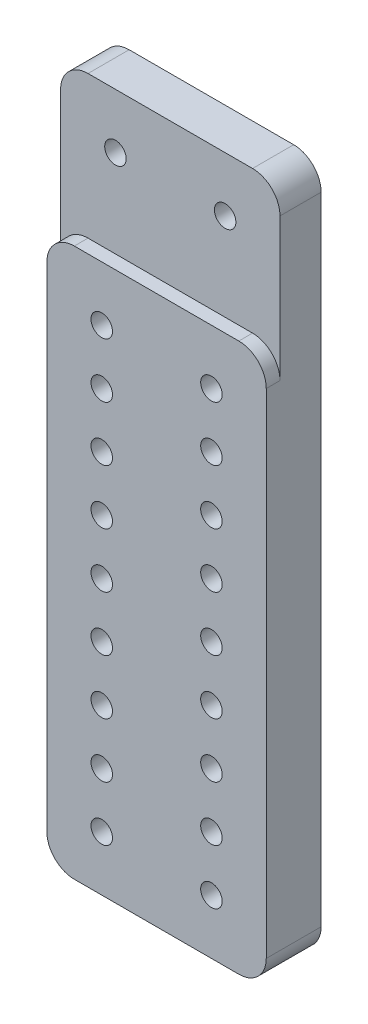
ISO-10303-21;
HEADER;
FILE_DESCRIPTION(('STEP AP214'),'2;1');
FILE_NAME('part.step','',(''),(''),'','','');
FILE_SCHEMA(('AUTOMOTIVE_DESIGN { 1 0 10303 214 1 1 1 1 }'));
ENDSEC;
DATA;
#1=APPLICATION_CONTEXT('core data for automotive mechanical design processes');
#2=APPLICATION_PROTOCOL_DEFINITION('international standard','automotive_design',2000,#1);
#3=PRODUCT_CONTEXT('',#1,'mechanical');
#4=PRODUCT('Part','Part','',(#3));
#5=PRODUCT_RELATED_PRODUCT_CATEGORY('part','',(#4));
#6=PRODUCT_DEFINITION_FORMATION('','',#4);
#7=PRODUCT_DEFINITION_CONTEXT('part definition',#1,'design');
#8=PRODUCT_DEFINITION('design','',#6,#7);
#9=PRODUCT_DEFINITION_SHAPE('','',#8);
#10=(LENGTH_UNIT() NAMED_UNIT(*) SI_UNIT(.MILLI.,.METRE.));
#11=(NAMED_UNIT(*) PLANE_ANGLE_UNIT() SI_UNIT($,.RADIAN.));
#12=(NAMED_UNIT(*) SI_UNIT($,.STERADIAN.) SOLID_ANGLE_UNIT());
#13=UNCERTAINTY_MEASURE_WITH_UNIT(LENGTH_MEASURE(1.E-05),#10,'distance_accuracy_value','');
#14=(GEOMETRIC_REPRESENTATION_CONTEXT(3) GLOBAL_UNCERTAINTY_ASSIGNED_CONTEXT((#13)) GLOBAL_UNIT_ASSIGNED_CONTEXT((#10,
#11,#12)) REPRESENTATION_CONTEXT('',''));
#15=CARTESIAN_POINT('',(0.,0.,0.));
#16=DIRECTION('',(0.,0.,1.));
#17=DIRECTION('',(1.,0.,0.));
#18=AXIS2_PLACEMENT_3D('',#15,#16,#17);
#19=CARTESIAN_POINT('',(0.,0.,-12.7));
#20=DIRECTION('',(-1.,0.,0.));
#21=DIRECTION('',(0.,0.,1.));
#22=AXIS2_PLACEMENT_3D('',#19,#20,#21);
#23=PLANE('',#22);
#24=DIRECTION('',(0.,-1.,0.));
#25=VECTOR('',#24,1.);
#26=CARTESIAN_POINT('',(0.,0.,0.));
#27=LINE('',#26,#25);
#28=CARTESIAN_POINT('',(0.,120.65,0.));
#29=VERTEX_POINT('',#28);
#30=CARTESIAN_POINT('',(0.,6.35,0.));
#31=VERTEX_POINT('',#30);
#32=EDGE_CURVE('E217',#29,#31,#27,.T.);
#33=ORIENTED_EDGE('',*,*,#32,.F.);
#34=DIRECTION('',(0.,0.,1.));
#35=VECTOR('',#34,1.);
#36=CARTESIAN_POINT('',(0.,120.65,-3.175));
#37=LINE('',#36,#35);
#38=CARTESIAN_POINT('',(0.,120.65,-3.175));
#39=VERTEX_POINT('',#38);
#40=EDGE_CURVE('E142',#29,#39,#37,.F.);
#41=ORIENTED_EDGE('',*,*,#40,.T.);
#42=DIRECTION('',(0.,-1.,0.));
#43=VECTOR('',#42,1.);
#44=CARTESIAN_POINT('',(0.,160.02,-3.175));
#45=LINE('',#44,#43);
#46=CARTESIAN_POINT('',(0.,153.67,-3.175));
#47=VERTEX_POINT('',#46);
#48=EDGE_CURVE('E53',#47,#39,#45,.T.);
#49=ORIENTED_EDGE('',*,*,#48,.F.);
#50=DIRECTION('',(0.,0.,1.));
#51=VECTOR('',#50,1.);
#52=CARTESIAN_POINT('',(0.,153.67,-12.7));
#53=LINE('',#52,#51);
#54=CARTESIAN_POINT('',(0.,153.67,-12.7));
#55=VERTEX_POINT('',#54);
#56=EDGE_CURVE('E139',#47,#55,#53,.F.);
#57=ORIENTED_EDGE('',*,*,#56,.T.);
#58=DIRECTION('',(0.,-1.,0.));
#59=VECTOR('',#58,1.);
#60=CARTESIAN_POINT('',(0.,0.,-12.7));
#61=LINE('',#60,#59);
#62=CARTESIAN_POINT('',(0.,6.35,-12.7));
#63=VERTEX_POINT('',#62);
#64=EDGE_CURVE('E213',#55,#63,#61,.T.);
#65=ORIENTED_EDGE('',*,*,#64,.T.);
#66=DIRECTION('',(0.,0.,1.));
#67=VECTOR('',#66,1.);
#68=CARTESIAN_POINT('',(0.,6.35,-12.7));
#69=LINE('',#68,#67);
#70=EDGE_CURVE('E148',#63,#31,#69,.T.);
#71=ORIENTED_EDGE('',*,*,#70,.T.);
#72=EDGE_LOOP('',(#33,#41,#49,#57,#65,#71));
#73=FACE_BOUND('',#72,.T.);
#74=ADVANCED_FACE('F39',(#73),#23,.T.);
#75=CARTESIAN_POINT('',(0.,160.02,-12.7));
#76=DIRECTION('',(0.,1.,0.));
#77=DIRECTION('',(0.,0.,1.));
#78=AXIS2_PLACEMENT_3D('',#75,#76,#77);
#79=PLANE('',#78);
#80=DIRECTION('',(-1.,0.,0.));
#81=VECTOR('',#80,1.);
#82=CARTESIAN_POINT('',(50.8,160.02,-3.175));
#83=LINE('',#82,#81);
#84=CARTESIAN_POINT('',(44.45,160.02,-3.175));
#85=VERTEX_POINT('',#84);
#86=CARTESIAN_POINT('',(6.35,160.02,-3.175));
#87=VERTEX_POINT('',#86);
#88=EDGE_CURVE('E128',#85,#87,#83,.T.);
#89=ORIENTED_EDGE('',*,*,#88,.F.);
#90=DIRECTION('',(0.,0.,1.));
#91=VECTOR('',#90,1.);
#92=CARTESIAN_POINT('',(44.45,160.02,-12.7));
#93=LINE('',#92,#91);
#94=CARTESIAN_POINT('',(44.45,160.02,-12.7));
#95=VERTEX_POINT('',#94);
#96=EDGE_CURVE('E134',#85,#95,#93,.F.);
#97=ORIENTED_EDGE('',*,*,#96,.T.);
#98=DIRECTION('',(-1.,0.,0.));
#99=VECTOR('',#98,1.);
#100=CARTESIAN_POINT('',(0.,160.02,-12.7));
#101=LINE('',#100,#99);
#102=CARTESIAN_POINT('',(6.35,160.02,-12.7));
#103=VERTEX_POINT('',#102);
#104=EDGE_CURVE('E149',#95,#103,#101,.T.);
#105=ORIENTED_EDGE('',*,*,#104,.T.);
#106=DIRECTION('',(0.,0.,1.));
#107=VECTOR('',#106,1.);
#108=CARTESIAN_POINT('',(6.35,160.02,-12.7));
#109=LINE('',#108,#107);
#110=EDGE_CURVE('E181',#103,#87,#109,.T.);
#111=ORIENTED_EDGE('',*,*,#110,.T.);
#112=EDGE_LOOP('',(#89,#97,#105,#111));
#113=FACE_BOUND('',#112,.T.);
#114=ADVANCED_FACE('F360',(#113),#79,.T.);
#115=CARTESIAN_POINT('',(50.8,0.,-12.7));
#116=DIRECTION('',(1.,0.,0.));
#117=DIRECTION('',(0.,0.,-1.));
#118=AXIS2_PLACEMENT_3D('',#115,#116,#117);
#119=PLANE('',#118);
#120=DIRECTION('',(0.,-1.,0.));
#121=VECTOR('',#120,1.);
#122=CARTESIAN_POINT('',(50.8,160.02,-3.175));
#123=LINE('',#122,#121);
#124=CARTESIAN_POINT('',(50.8,153.67,-3.175));
#125=VERTEX_POINT('',#124);
#126=CARTESIAN_POINT('',(50.8,120.65,-3.175));
#127=VERTEX_POINT('',#126);
#128=EDGE_CURVE('E143',#125,#127,#123,.T.);
#129=ORIENTED_EDGE('',*,*,#128,.T.);
#130=DIRECTION('',(0.,0.,1.));
#131=VECTOR('',#130,1.);
#132=CARTESIAN_POINT('',(50.8,120.65,0.));
#133=LINE('',#132,#131);
#134=CARTESIAN_POINT('',(50.8,120.65,0.));
#135=VERTEX_POINT('',#134);
#136=EDGE_CURVE('E133',#127,#135,#133,.T.);
#137=ORIENTED_EDGE('',*,*,#136,.T.);
#138=DIRECTION('',(0.,1.,0.));
#139=VECTOR('',#138,1.);
#140=CARTESIAN_POINT('',(50.8,0.,0.));
#141=LINE('',#140,#139);
#142=CARTESIAN_POINT('',(50.8,6.35,0.));
#143=VERTEX_POINT('',#142);
#144=EDGE_CURVE('E158',#143,#135,#141,.T.);
#145=ORIENTED_EDGE('',*,*,#144,.F.);
#146=DIRECTION('',(0.,0.,1.));
#147=VECTOR('',#146,1.);
#148=CARTESIAN_POINT('',(50.8,6.35,-12.7));
#149=LINE('',#148,#147);
#150=CARTESIAN_POINT('',(50.8,6.35,-12.7));
#151=VERTEX_POINT('',#150);
#152=EDGE_CURVE('E179',#143,#151,#149,.F.);
#153=ORIENTED_EDGE('',*,*,#152,.T.);
#154=DIRECTION('',(0.,1.,0.));
#155=VECTOR('',#154,1.);
#156=CARTESIAN_POINT('',(50.8,0.,-12.7));
#157=LINE('',#156,#155);
#158=CARTESIAN_POINT('',(50.8,153.67,-12.7));
#159=VERTEX_POINT('',#158);
#160=EDGE_CURVE('E155',#151,#159,#157,.T.);
#161=ORIENTED_EDGE('',*,*,#160,.T.);
#162=DIRECTION('',(0.,0.,1.));
#163=VECTOR('',#162,1.);
#164=CARTESIAN_POINT('',(50.8,153.67,-12.7));
#165=LINE('',#164,#163);
#166=EDGE_CURVE('E176',#159,#125,#165,.T.);
#167=ORIENTED_EDGE('',*,*,#166,.T.);
#168=EDGE_LOOP('',(#129,#137,#145,#153,#161,#167));
#169=FACE_BOUND('',#168,.T.);
#170=ADVANCED_FACE('F206',(#169),#119,.T.);
#171=CARTESIAN_POINT('',(0.,0.,-12.7));
#172=DIRECTION('',(0.,-1.,0.));
#173=DIRECTION('',(0.,0.,-1.));
#174=AXIS2_PLACEMENT_3D('',#171,#172,#173);
#175=PLANE('',#174);
#176=DIRECTION('',(1.,0.,0.));
#177=VECTOR('',#176,1.);
#178=CARTESIAN_POINT('',(0.,0.,0.));
#179=LINE('',#178,#177);
#180=CARTESIAN_POINT('',(6.35,0.,0.));
#181=VERTEX_POINT('',#180);
#182=CARTESIAN_POINT('',(44.45,0.,0.));
#183=VERTEX_POINT('',#182);
#184=EDGE_CURVE('E214',#181,#183,#179,.T.);
#185=ORIENTED_EDGE('',*,*,#184,.F.);
#186=DIRECTION('',(0.,0.,1.));
#187=VECTOR('',#186,1.);
#188=CARTESIAN_POINT('',(6.35,0.,-12.7));
#189=LINE('',#188,#187);
#190=CARTESIAN_POINT('',(6.35,0.,-12.7));
#191=VERTEX_POINT('',#190);
#192=EDGE_CURVE('E167',#181,#191,#189,.F.);
#193=ORIENTED_EDGE('',*,*,#192,.T.);
#194=DIRECTION('',(1.,0.,0.));
#195=VECTOR('',#194,1.);
#196=CARTESIAN_POINT('',(0.,0.,-12.7));
#197=LINE('',#196,#195);
#198=CARTESIAN_POINT('',(44.45,0.,-12.7));
#199=VERTEX_POINT('',#198);
#200=EDGE_CURVE('E215',#191,#199,#197,.T.);
#201=ORIENTED_EDGE('',*,*,#200,.T.);
#202=DIRECTION('',(0.,0.,1.));
#203=VECTOR('',#202,1.);
#204=CARTESIAN_POINT('',(44.45,0.,-12.7));
#205=LINE('',#204,#203);
#206=EDGE_CURVE('E164',#199,#183,#205,.T.);
#207=ORIENTED_EDGE('',*,*,#206,.T.);
#208=EDGE_LOOP('',(#185,#193,#201,#207));
#209=FACE_BOUND('',#208,.T.);
#210=ADVANCED_FACE('F371',(#209),#175,.T.);
#211=CARTESIAN_POINT('',(0.,0.,-12.7));
#212=DIRECTION('',(0.,0.,-1.));
#213=DIRECTION('',(-1.,0.,0.));
#214=AXIS2_PLACEMENT_3D('',#211,#212,#213);
#215=PLANE('',#214);
#216=CARTESIAN_POINT('',(38.1,63.5,-12.7));
#217=DIRECTION('',(0.,0.,1.));
#218=DIRECTION('',(1.,0.,0.));
#219=AXIS2_PLACEMENT_3D('',#216,#217,#218);
#220=CIRCLE('',#219,2.4892);
#221=CARTESIAN_POINT('',(40.5892,63.5,-12.7));
#222=VERTEX_POINT('',#221);
#223=EDGE_CURVE('E296',#222,#222,#220,.T.);
#224=ORIENTED_EDGE('',*,*,#223,.T.);
#225=EDGE_LOOP('',(#224));
#226=FACE_BOUND('',#225,.T.);
#227=CARTESIAN_POINT('',(38.1,114.3,-12.7));
#228=DIRECTION('',(0.,0.,1.));
#229=DIRECTION('',(1.,0.,0.));
#230=AXIS2_PLACEMENT_3D('',#227,#228,#229);
#231=CIRCLE('',#230,2.4892);
#232=CARTESIAN_POINT('',(40.5892,114.3,-12.7));
#233=VERTEX_POINT('',#232);
#234=EDGE_CURVE('E290',#233,#233,#231,.T.);
#235=ORIENTED_EDGE('',*,*,#234,.T.);
#236=EDGE_LOOP('',(#235));
#237=FACE_BOUND('',#236,.T.);
#238=CARTESIAN_POINT('',(12.7,50.8,-12.7));
#239=DIRECTION('',(0.,0.,1.));
#240=DIRECTION('',(1.,0.,0.));
#241=AXIS2_PLACEMENT_3D('',#238,#239,#240);
#242=CIRCLE('',#241,2.4892);
#243=CARTESIAN_POINT('',(15.1892,50.8,-12.7));
#244=VERTEX_POINT('',#243);
#245=EDGE_CURVE('E284',#244,#244,#242,.T.);
#246=ORIENTED_EDGE('',*,*,#245,.T.);
#247=EDGE_LOOP('',(#246));
#248=FACE_BOUND('',#247,.T.);
#249=CARTESIAN_POINT('',(12.7,38.1,-12.7));
#250=DIRECTION('',(0.,0.,1.));
#251=DIRECTION('',(1.,0.,0.));
#252=AXIS2_PLACEMENT_3D('',#249,#250,#251);
#253=CIRCLE('',#252,2.4892);
#254=CARTESIAN_POINT('',(15.1892,38.1,-12.7));
#255=VERTEX_POINT('',#254);
#256=EDGE_CURVE('E277',#255,#255,#253,.T.);
#257=ORIENTED_EDGE('',*,*,#256,.T.);
#258=EDGE_LOOP('',(#257));
#259=FACE_BOUND('',#258,.T.);
#260=CARTESIAN_POINT('',(12.7,25.4,-12.7));
#261=DIRECTION('',(0.,0.,1.));
#262=DIRECTION('',(1.,0.,0.));
#263=AXIS2_PLACEMENT_3D('',#260,#261,#262);
#264=CIRCLE('',#263,2.4892);
#265=CARTESIAN_POINT('',(15.1892,25.4,-12.7));
#266=VERTEX_POINT('',#265);
#267=EDGE_CURVE('E320',#266,#266,#264,.T.);
#268=ORIENTED_EDGE('',*,*,#267,.T.);
#269=EDGE_LOOP('',(#268));
#270=FACE_BOUND('',#269,.T.);
#271=CARTESIAN_POINT('',(12.7,12.7,-12.7));
#272=DIRECTION('',(0.,0.,1.));
#273=DIRECTION('',(1.,0.,0.));
#274=AXIS2_PLACEMENT_3D('',#271,#272,#273);
#275=CIRCLE('',#274,2.4892);
#276=CARTESIAN_POINT('',(15.1892,12.7,-12.7));
#277=VERTEX_POINT('',#276);
#278=EDGE_CURVE('E314',#277,#277,#275,.T.);
#279=ORIENTED_EDGE('',*,*,#278,.T.);
#280=EDGE_LOOP('',(#279));
#281=FACE_BOUND('',#280,.T.);
#282=CARTESIAN_POINT('',(38.1,50.8,-12.7));
#283=DIRECTION('',(0.,0.,1.));
#284=DIRECTION('',(1.,0.,0.));
#285=AXIS2_PLACEMENT_3D('',#282,#283,#284);
#286=CIRCLE('',#285,2.4892);
#287=CARTESIAN_POINT('',(40.5892,50.8,-12.7));
#288=VERTEX_POINT('',#287);
#289=EDGE_CURVE('E308',#288,#288,#286,.T.);
#290=ORIENTED_EDGE('',*,*,#289,.T.);
#291=EDGE_LOOP('',(#290));
#292=FACE_BOUND('',#291,.T.);
#293=CARTESIAN_POINT('',(38.1,38.1,-12.7));
#294=DIRECTION('',(0.,0.,1.));
#295=DIRECTION('',(1.,0.,0.));
#296=AXIS2_PLACEMENT_3D('',#293,#294,#295);
#297=CIRCLE('',#296,2.4892);
#298=CARTESIAN_POINT('',(40.5892,38.1,-12.7));
#299=VERTEX_POINT('',#298);
#300=EDGE_CURVE('E301',#299,#299,#297,.T.);
#301=ORIENTED_EDGE('',*,*,#300,.T.);
#302=EDGE_LOOP('',(#301));
#303=FACE_BOUND('',#302,.T.);
#304=CARTESIAN_POINT('',(12.7,114.3,-12.7));
#305=DIRECTION('',(0.,0.,1.));
#306=DIRECTION('',(1.,0.,0.));
#307=AXIS2_PLACEMENT_3D('',#304,#305,#306);
#308=CIRCLE('',#307,2.4892);
#309=CARTESIAN_POINT('',(15.1892,114.3,-12.7));
#310=VERTEX_POINT('',#309);
#311=EDGE_CURVE('E248',#310,#310,#308,.T.);
#312=ORIENTED_EDGE('',*,*,#311,.T.);
#313=EDGE_LOOP('',(#312));
#314=FACE_BOUND('',#313,.T.);
#315=CARTESIAN_POINT('',(12.7,101.6,-12.7));
#316=DIRECTION('',(0.,0.,1.));
#317=DIRECTION('',(1.,0.,0.));
#318=AXIS2_PLACEMENT_3D('',#315,#316,#317);
#319=CIRCLE('',#318,2.4892);
#320=CARTESIAN_POINT('',(15.1892,101.6,-12.7));
#321=VERTEX_POINT('',#320);
#322=EDGE_CURVE('E242',#321,#321,#319,.T.);
#323=ORIENTED_EDGE('',*,*,#322,.T.);
#324=EDGE_LOOP('',(#323));
#325=FACE_BOUND('',#324,.T.);
#326=CARTESIAN_POINT('',(12.7,88.9,-12.7));
#327=DIRECTION('',(0.,0.,1.));
#328=DIRECTION('',(1.,0.,0.));
#329=AXIS2_PLACEMENT_3D('',#326,#327,#328);
#330=CIRCLE('',#329,2.4892);
#331=CARTESIAN_POINT('',(15.1892,88.9,-12.7));
#332=VERTEX_POINT('',#331);
#333=EDGE_CURVE('E236',#332,#332,#330,.T.);
#334=ORIENTED_EDGE('',*,*,#333,.T.);
#335=EDGE_LOOP('',(#334));
#336=FACE_BOUND('',#335,.T.);
#337=CARTESIAN_POINT('',(12.7,76.2,-12.7));
#338=DIRECTION('',(0.,0.,1.));
#339=DIRECTION('',(1.,0.,0.));
#340=AXIS2_PLACEMENT_3D('',#337,#338,#339);
#341=CIRCLE('',#340,2.4892);
#342=CARTESIAN_POINT('',(15.1892,76.2,-12.7));
#343=VERTEX_POINT('',#342);
#344=EDGE_CURVE('E229',#343,#343,#341,.T.);
#345=ORIENTED_EDGE('',*,*,#344,.T.);
#346=EDGE_LOOP('',(#345));
#347=FACE_BOUND('',#346,.T.);
#348=CARTESIAN_POINT('',(38.1,76.2,-12.7));
#349=DIRECTION('',(0.,0.,1.));
#350=DIRECTION('',(1.,0.,0.));
#351=AXIS2_PLACEMENT_3D('',#348,#349,#350);
#352=CIRCLE('',#351,2.4892);
#353=CARTESIAN_POINT('',(40.5892,76.2,-12.7));
#354=VERTEX_POINT('',#353);
#355=EDGE_CURVE('E265',#354,#354,#352,.T.);
#356=ORIENTED_EDGE('',*,*,#355,.T.);
#357=EDGE_LOOP('',(#356));
#358=FACE_BOUND('',#357,.T.);
#359=CARTESIAN_POINT('',(38.1,88.9,-12.7));
#360=DIRECTION('',(0.,0.,1.));
#361=DIRECTION('',(1.,0.,0.));
#362=AXIS2_PLACEMENT_3D('',#359,#360,#361);
#363=CIRCLE('',#362,2.4892);
#364=CARTESIAN_POINT('',(40.5892,88.9,-12.7));
#365=VERTEX_POINT('',#364);
#366=EDGE_CURVE('E272',#365,#365,#363,.T.);
#367=ORIENTED_EDGE('',*,*,#366,.T.);
#368=EDGE_LOOP('',(#367));
#369=FACE_BOUND('',#368,.T.);
#370=CARTESIAN_POINT('',(38.1,101.6,-12.7));
#371=DIRECTION('',(0.,0.,1.));
#372=DIRECTION('',(1.,0.,0.));
#373=AXIS2_PLACEMENT_3D('',#370,#371,#372);
#374=CIRCLE('',#373,2.48920000000001);
#375=CARTESIAN_POINT('',(40.5892,101.6,-12.7));
#376=VERTEX_POINT('',#375);
#377=EDGE_CURVE('E253',#376,#376,#374,.T.);
#378=ORIENTED_EDGE('',*,*,#377,.T.);
#379=EDGE_LOOP('',(#378));
#380=FACE_BOUND('',#379,.T.);
#381=CARTESIAN_POINT('',(12.7,63.5,-12.7));
#382=DIRECTION('',(0.,0.,1.));
#383=DIRECTION('',(1.,0.,0.));
#384=AXIS2_PLACEMENT_3D('',#381,#382,#383);
#385=CIRCLE('',#384,2.4892);
#386=CARTESIAN_POINT('',(15.1892,63.5,-12.7));
#387=VERTEX_POINT('',#386);
#388=EDGE_CURVE('E260',#387,#387,#385,.T.);
#389=ORIENTED_EDGE('',*,*,#388,.T.);
#390=EDGE_LOOP('',(#389));
#391=FACE_BOUND('',#390,.T.);
#392=CARTESIAN_POINT('',(38.1,147.32,-12.7));
#393=DIRECTION('',(0.,0.,1.));
#394=DIRECTION('',(1.,0.,0.));
#395=AXIS2_PLACEMENT_3D('',#392,#393,#394);
#396=CIRCLE('',#395,2.48920000000001);
#397=CARTESIAN_POINT('',(40.5892,147.32,-12.7));
#398=VERTEX_POINT('',#397);
#399=EDGE_CURVE('E305',#398,#398,#396,.T.);
#400=ORIENTED_EDGE('',*,*,#399,.T.);
#401=EDGE_LOOP('',(#400));
#402=FACE_BOUND('',#401,.T.);
#403=CARTESIAN_POINT('',(38.1,25.4,-12.7));
#404=DIRECTION('',(0.,0.,1.));
#405=DIRECTION('',(1.,0.,0.));
#406=AXIS2_PLACEMENT_3D('',#403,#404,#405);
#407=CIRCLE('',#406,2.4892);
#408=CARTESIAN_POINT('',(40.5892,25.4,-12.7));
#409=VERTEX_POINT('',#408);
#410=EDGE_CURVE('E332',#409,#409,#407,.T.);
#411=ORIENTED_EDGE('',*,*,#410,.T.);
#412=EDGE_LOOP('',(#411));
#413=FACE_BOUND('',#412,.T.);
#414=CARTESIAN_POINT('',(38.1,12.7,-12.7));
#415=DIRECTION('',(0.,0.,1.));
#416=DIRECTION('',(1.,0.,0.));
#417=AXIS2_PLACEMENT_3D('',#414,#415,#416);
#418=CIRCLE('',#417,2.4892);
#419=CARTESIAN_POINT('',(40.5892,12.7,-12.7));
#420=VERTEX_POINT('',#419);
#421=EDGE_CURVE('E325',#420,#420,#418,.T.);
#422=ORIENTED_EDGE('',*,*,#421,.T.);
#423=EDGE_LOOP('',(#422));
#424=FACE_BOUND('',#423,.T.);
#425=CARTESIAN_POINT('',(12.7,147.32,-12.7));
#426=DIRECTION('',(0.,0.,1.));
#427=DIRECTION('',(1.,0.,0.));
#428=AXIS2_PLACEMENT_3D('',#425,#426,#427);
#429=CIRCLE('',#428,2.4892);
#430=CARTESIAN_POINT('',(15.1892,147.32,-12.7));
#431=VERTEX_POINT('',#430);
#432=EDGE_CURVE('E219',#431,#431,#429,.T.);
#433=ORIENTED_EDGE('',*,*,#432,.T.);
#434=EDGE_LOOP('',(#433));
#435=FACE_BOUND('',#434,.T.);
#436=ORIENTED_EDGE('',*,*,#200,.F.);
#437=CARTESIAN_POINT('',(6.35,6.35,-12.7));
#438=DIRECTION('',(0.,0.,-1.));
#439=DIRECTION('',(-1.,0.,0.));
#440=AXIS2_PLACEMENT_3D('',#437,#438,#439);
#441=CIRCLE('',#440,6.35);
#442=EDGE_CURVE('E174',#191,#63,#441,.T.);
#443=ORIENTED_EDGE('',*,*,#442,.T.);
#444=ORIENTED_EDGE('',*,*,#64,.F.);
#445=CARTESIAN_POINT('',(6.35,153.67,-12.7));
#446=DIRECTION('',(0.,0.,-1.));
#447=DIRECTION('',(-1.,0.,0.));
#448=AXIS2_PLACEMENT_3D('',#445,#446,#447);
#449=CIRCLE('',#448,6.35);
#450=EDGE_CURVE('E147',#55,#103,#449,.T.);
#451=ORIENTED_EDGE('',*,*,#450,.T.);
#452=ORIENTED_EDGE('',*,*,#104,.F.);
#453=CARTESIAN_POINT('',(44.45,153.67,-12.7));
#454=DIRECTION('',(0.,0.,-1.));
#455=DIRECTION('',(-1.,0.,0.));
#456=AXIS2_PLACEMENT_3D('',#453,#454,#455);
#457=CIRCLE('',#456,6.35);
#458=EDGE_CURVE('E170',#95,#159,#457,.T.);
#459=ORIENTED_EDGE('',*,*,#458,.T.);
#460=ORIENTED_EDGE('',*,*,#160,.F.);
#461=CARTESIAN_POINT('',(44.45,6.35,-12.7));
#462=DIRECTION('',(0.,0.,-1.));
#463=DIRECTION('',(-1.,0.,0.));
#464=AXIS2_PLACEMENT_3D('',#461,#462,#463);
#465=CIRCLE('',#464,6.35);
#466=EDGE_CURVE('E172',#151,#199,#465,.T.);
#467=ORIENTED_EDGE('',*,*,#466,.T.);
#468=EDGE_LOOP('',(#436,#443,#444,#451,#452,#459,#460,#467));
#469=FACE_BOUND('',#468,.T.);
#470=ADVANCED_FACE('F477',(#226,#237,#248,#259,#270,#281,#292,#303,#314,#325,#336,#347,#358,
#369,#380,#391,#402,#413,#424,#435,#469),#215,.T.);
#471=CARTESIAN_POINT('',(0.,0.,0.));
#472=DIRECTION('',(0.,0.,-1.));
#473=DIRECTION('',(-1.,0.,0.));
#474=AXIS2_PLACEMENT_3D('',#471,#472,#473);
#475=PLANE('',#474);
#476=CARTESIAN_POINT('',(38.1,63.5,0.));
#477=DIRECTION('',(0.,0.,1.));
#478=DIRECTION('',(1.,0.,0.));
#479=AXIS2_PLACEMENT_3D('',#476,#477,#478);
#480=CIRCLE('',#479,2.4892);
#481=CARTESIAN_POINT('',(40.5892,63.5,0.));
#482=VERTEX_POINT('',#481);
#483=EDGE_CURVE('E269',#482,#482,#480,.T.);
#484=ORIENTED_EDGE('',*,*,#483,.F.);
#485=EDGE_LOOP('',(#484));
#486=FACE_BOUND('',#485,.T.);
#487=CARTESIAN_POINT('',(38.1,114.3,0.));
#488=DIRECTION('',(0.,0.,1.));
#489=DIRECTION('',(1.,0.,0.));
#490=AXIS2_PLACEMENT_3D('',#487,#488,#489);
#491=CIRCLE('',#490,2.4892);
#492=CARTESIAN_POINT('',(40.5892,114.3,0.));
#493=VERTEX_POINT('',#492);
#494=EDGE_CURVE('E293',#493,#493,#491,.T.);
#495=ORIENTED_EDGE('',*,*,#494,.F.);
#496=EDGE_LOOP('',(#495));
#497=FACE_BOUND('',#496,.T.);
#498=CARTESIAN_POINT('',(12.7,50.8,0.));
#499=DIRECTION('',(0.,0.,1.));
#500=DIRECTION('',(1.,0.,0.));
#501=AXIS2_PLACEMENT_3D('',#498,#499,#500);
#502=CIRCLE('',#501,2.4892);
#503=CARTESIAN_POINT('',(15.1892,50.8,0.));
#504=VERTEX_POINT('',#503);
#505=EDGE_CURVE('E287',#504,#504,#502,.T.);
#506=ORIENTED_EDGE('',*,*,#505,.F.);
#507=EDGE_LOOP('',(#506));
#508=FACE_BOUND('',#507,.T.);
#509=CARTESIAN_POINT('',(12.7,38.1,0.));
#510=DIRECTION('',(0.,0.,1.));
#511=DIRECTION('',(1.,0.,0.));
#512=AXIS2_PLACEMENT_3D('',#509,#510,#511);
#513=CIRCLE('',#512,2.4892);
#514=CARTESIAN_POINT('',(15.1892,38.1,0.));
#515=VERTEX_POINT('',#514);
#516=EDGE_CURVE('E280',#515,#515,#513,.T.);
#517=ORIENTED_EDGE('',*,*,#516,.F.);
#518=EDGE_LOOP('',(#517));
#519=FACE_BOUND('',#518,.T.);
#520=CARTESIAN_POINT('',(12.7,25.4,0.));
#521=DIRECTION('',(0.,0.,1.));
#522=DIRECTION('',(1.,0.,0.));
#523=AXIS2_PLACEMENT_3D('',#520,#521,#522);
#524=CIRCLE('',#523,2.4892);
#525=CARTESIAN_POINT('',(15.1892,25.4,0.));
#526=VERTEX_POINT('',#525);
#527=EDGE_CURVE('E281',#526,#526,#524,.T.);
#528=ORIENTED_EDGE('',*,*,#527,.F.);
#529=EDGE_LOOP('',(#528));
#530=FACE_BOUND('',#529,.T.);
#531=CARTESIAN_POINT('',(12.7,12.7,0.));
#532=DIRECTION('',(0.,0.,1.));
#533=DIRECTION('',(1.,0.,0.));
#534=AXIS2_PLACEMENT_3D('',#531,#532,#533);
#535=CIRCLE('',#534,2.4892);
#536=CARTESIAN_POINT('',(15.1892,12.7,0.));
#537=VERTEX_POINT('',#536);
#538=EDGE_CURVE('E317',#537,#537,#535,.T.);
#539=ORIENTED_EDGE('',*,*,#538,.F.);
#540=EDGE_LOOP('',(#539));
#541=FACE_BOUND('',#540,.T.);
#542=CARTESIAN_POINT('',(38.1,50.8,0.));
#543=DIRECTION('',(0.,0.,1.));
#544=DIRECTION('',(1.,0.,0.));
#545=AXIS2_PLACEMENT_3D('',#542,#543,#544);
#546=CIRCLE('',#545,2.4892);
#547=CARTESIAN_POINT('',(40.5892,50.8,0.));
#548=VERTEX_POINT('',#547);
#549=EDGE_CURVE('E311',#548,#548,#546,.T.);
#550=ORIENTED_EDGE('',*,*,#549,.F.);
#551=EDGE_LOOP('',(#550));
#552=FACE_BOUND('',#551,.T.);
#553=CARTESIAN_POINT('',(38.1,38.1,0.));
#554=DIRECTION('',(0.,0.,1.));
#555=DIRECTION('',(1.,0.,0.));
#556=AXIS2_PLACEMENT_3D('',#553,#554,#555);
#557=CIRCLE('',#556,2.4892);
#558=CARTESIAN_POINT('',(40.5892,38.1,0.));
#559=VERTEX_POINT('',#558);
#560=EDGE_CURVE('E304',#559,#559,#557,.T.);
#561=ORIENTED_EDGE('',*,*,#560,.F.);
#562=EDGE_LOOP('',(#561));
#563=FACE_BOUND('',#562,.T.);
#564=CARTESIAN_POINT('',(12.7,114.3,0.));
#565=DIRECTION('',(0.,0.,1.));
#566=DIRECTION('',(1.,0.,0.));
#567=AXIS2_PLACEMENT_3D('',#564,#565,#566);
#568=CIRCLE('',#567,2.4892);
#569=CARTESIAN_POINT('',(15.1892,114.3,0.));
#570=VERTEX_POINT('',#569);
#571=EDGE_CURVE('E228',#570,#570,#568,.T.);
#572=ORIENTED_EDGE('',*,*,#571,.F.);
#573=EDGE_LOOP('',(#572));
#574=FACE_BOUND('',#573,.T.);
#575=CARTESIAN_POINT('',(12.7,101.6,0.));
#576=DIRECTION('',(0.,0.,1.));
#577=DIRECTION('',(1.,0.,0.));
#578=AXIS2_PLACEMENT_3D('',#575,#576,#577);
#579=CIRCLE('',#578,2.4892);
#580=CARTESIAN_POINT('',(15.1892,101.6,0.));
#581=VERTEX_POINT('',#580);
#582=EDGE_CURVE('E245',#581,#581,#579,.T.);
#583=ORIENTED_EDGE('',*,*,#582,.F.);
#584=EDGE_LOOP('',(#583));
#585=FACE_BOUND('',#584,.T.);
#586=CARTESIAN_POINT('',(12.7,88.9,0.));
#587=DIRECTION('',(0.,0.,1.));
#588=DIRECTION('',(1.,0.,0.));
#589=AXIS2_PLACEMENT_3D('',#586,#587,#588);
#590=CIRCLE('',#589,2.4892);
#591=CARTESIAN_POINT('',(15.1892,88.9,0.));
#592=VERTEX_POINT('',#591);
#593=EDGE_CURVE('E239',#592,#592,#590,.T.);
#594=ORIENTED_EDGE('',*,*,#593,.F.);
#595=EDGE_LOOP('',(#594));
#596=FACE_BOUND('',#595,.T.);
#597=CARTESIAN_POINT('',(12.7,76.2,0.));
#598=DIRECTION('',(0.,0.,1.));
#599=DIRECTION('',(1.,0.,0.));
#600=AXIS2_PLACEMENT_3D('',#597,#598,#599);
#601=CIRCLE('',#600,2.4892);
#602=CARTESIAN_POINT('',(15.1892,76.2,0.));
#603=VERTEX_POINT('',#602);
#604=EDGE_CURVE('E232',#603,#603,#601,.T.);
#605=ORIENTED_EDGE('',*,*,#604,.F.);
#606=EDGE_LOOP('',(#605));
#607=FACE_BOUND('',#606,.T.);
#608=CARTESIAN_POINT('',(38.1,76.2,0.));
#609=DIRECTION('',(0.,0.,1.));
#610=DIRECTION('',(1.,0.,0.));
#611=AXIS2_PLACEMENT_3D('',#608,#609,#610);
#612=CIRCLE('',#611,2.4892);
#613=CARTESIAN_POINT('',(40.5892,76.2,0.));
#614=VERTEX_POINT('',#613);
#615=EDGE_CURVE('E268',#614,#614,#612,.T.);
#616=ORIENTED_EDGE('',*,*,#615,.F.);
#617=EDGE_LOOP('',(#616));
#618=FACE_BOUND('',#617,.T.);
#619=CARTESIAN_POINT('',(38.1,88.9,0.));
#620=DIRECTION('',(0.,0.,1.));
#621=DIRECTION('',(1.,0.,0.));
#622=AXIS2_PLACEMENT_3D('',#619,#620,#621);
#623=CIRCLE('',#622,2.4892);
#624=CARTESIAN_POINT('',(40.5892,88.9,0.));
#625=VERTEX_POINT('',#624);
#626=EDGE_CURVE('E257',#625,#625,#623,.T.);
#627=ORIENTED_EDGE('',*,*,#626,.F.);
#628=EDGE_LOOP('',(#627));
#629=FACE_BOUND('',#628,.T.);
#630=CARTESIAN_POINT('',(38.1,101.6,0.));
#631=DIRECTION('',(0.,0.,1.));
#632=DIRECTION('',(1.,0.,0.));
#633=AXIS2_PLACEMENT_3D('',#630,#631,#632);
#634=CIRCLE('',#633,2.48920000000001);
#635=CARTESIAN_POINT('',(40.5892,101.6,0.));
#636=VERTEX_POINT('',#635);
#637=EDGE_CURVE('E256',#636,#636,#634,.T.);
#638=ORIENTED_EDGE('',*,*,#637,.F.);
#639=EDGE_LOOP('',(#638));
#640=FACE_BOUND('',#639,.T.);
#641=CARTESIAN_POINT('',(12.7,63.5,0.));
#642=DIRECTION('',(0.,0.,1.));
#643=DIRECTION('',(1.,0.,0.));
#644=AXIS2_PLACEMENT_3D('',#641,#642,#643);
#645=CIRCLE('',#644,2.4892);
#646=CARTESIAN_POINT('',(15.1892,63.5,0.));
#647=VERTEX_POINT('',#646);
#648=EDGE_CURVE('E233',#647,#647,#645,.T.);
#649=ORIENTED_EDGE('',*,*,#648,.F.);
#650=EDGE_LOOP('',(#649));
#651=FACE_BOUND('',#650,.T.);
#652=CARTESIAN_POINT('',(38.1,25.4,0.));
#653=DIRECTION('',(0.,0.,1.));
#654=DIRECTION('',(1.,0.,0.));
#655=AXIS2_PLACEMENT_3D('',#652,#653,#654);
#656=CIRCLE('',#655,2.4892);
#657=CARTESIAN_POINT('',(40.5892,25.4,0.));
#658=VERTEX_POINT('',#657);
#659=EDGE_CURVE('E335',#658,#658,#656,.T.);
#660=ORIENTED_EDGE('',*,*,#659,.F.);
#661=EDGE_LOOP('',(#660));
#662=FACE_BOUND('',#661,.T.);
#663=CARTESIAN_POINT('',(38.1,12.7,0.));
#664=DIRECTION('',(0.,0.,1.));
#665=DIRECTION('',(1.,0.,0.));
#666=AXIS2_PLACEMENT_3D('',#663,#664,#665);
#667=CIRCLE('',#666,2.4892);
#668=CARTESIAN_POINT('',(40.5892,12.7,0.));
#669=VERTEX_POINT('',#668);
#670=EDGE_CURVE('E328',#669,#669,#667,.T.);
#671=ORIENTED_EDGE('',*,*,#670,.F.);
#672=EDGE_LOOP('',(#671));
#673=FACE_BOUND('',#672,.T.);
#674=ORIENTED_EDGE('',*,*,#144,.T.);
#675=CARTESIAN_POINT('',(44.45,120.65,0.));
#676=DIRECTION('',(0.,0.,-1.));
#677=DIRECTION('',(-1.,0.,0.));
#678=AXIS2_PLACEMENT_3D('',#675,#676,#677);
#679=CIRCLE('',#678,6.35);
#680=CARTESIAN_POINT('',(44.45,127.,0.));
#681=VERTEX_POINT('',#680);
#682=EDGE_CURVE('E188',#135,#681,#679,.F.);
#683=ORIENTED_EDGE('',*,*,#682,.T.);
#684=DIRECTION('',(-1.,0.,0.));
#685=VECTOR('',#684,1.);
#686=CARTESIAN_POINT('',(50.8,127.,0.));
#687=LINE('',#686,#685);
#688=CARTESIAN_POINT('',(6.35,127.,0.));
#689=VERTEX_POINT('',#688);
#690=EDGE_CURVE('E348',#681,#689,#687,.T.);
#691=ORIENTED_EDGE('',*,*,#690,.T.);
#692=CARTESIAN_POINT('',(6.35,120.65,0.));
#693=DIRECTION('',(0.,0.,-1.));
#694=DIRECTION('',(-1.,0.,0.));
#695=AXIS2_PLACEMENT_3D('',#692,#693,#694);
#696=CIRCLE('',#695,6.35);
#697=EDGE_CURVE('E186',#689,#29,#696,.F.);
#698=ORIENTED_EDGE('',*,*,#697,.T.);
#699=ORIENTED_EDGE('',*,*,#32,.T.);
#700=CARTESIAN_POINT('',(6.35,6.35,0.));
#701=DIRECTION('',(0.,0.,-1.));
#702=DIRECTION('',(-1.,0.,0.));
#703=AXIS2_PLACEMENT_3D('',#700,#701,#702);
#704=CIRCLE('',#703,6.35);
#705=EDGE_CURVE('E162',#31,#181,#704,.F.);
#706=ORIENTED_EDGE('',*,*,#705,.T.);
#707=ORIENTED_EDGE('',*,*,#184,.T.);
#708=CARTESIAN_POINT('',(44.45,6.35,0.));
#709=DIRECTION('',(0.,0.,-1.));
#710=DIRECTION('',(-1.,0.,0.));
#711=AXIS2_PLACEMENT_3D('',#708,#709,#710);
#712=CIRCLE('',#711,6.35);
#713=EDGE_CURVE('E152',#183,#143,#712,.F.);
#714=ORIENTED_EDGE('',*,*,#713,.T.);
#715=EDGE_LOOP('',(#674,#683,#691,#698,#699,#706,#707,#714));
#716=FACE_BOUND('',#715,.T.);
#717=ADVANCED_FACE('F209',(#486,#497,#508,#519,#530,#541,#552,#563,#574,#585,#596,#607,#618,
#629,#640,#651,#662,#673,#716),#475,.F.);
#718=CARTESIAN_POINT('',(12.7,147.32,-12.7));
#719=DIRECTION('',(0.,0.,1.));
#720=DIRECTION('',(1.,0.,0.));
#721=AXIS2_PLACEMENT_3D('',#718,#719,#720);
#722=CYLINDRICAL_SURFACE('',#721,2.4892);
#723=CARTESIAN_POINT('',(12.7,147.32,-3.175));
#724=DIRECTION('',(0.,0.,-1.));
#725=DIRECTION('',(0.,1.,0.));
#726=AXIS2_PLACEMENT_3D('',#723,#724,#725);
#727=CIRCLE('',#726,2.4892);
#728=CARTESIAN_POINT('',(12.7,149.8092,-3.175));
#729=VERTEX_POINT('',#728);
#730=EDGE_CURVE('E329',#729,#729,#727,.F.);
#731=ORIENTED_EDGE('',*,*,#730,.T.);
#732=EDGE_LOOP('',(#731));
#733=FACE_BOUND('',#732,.T.);
#734=ORIENTED_EDGE('',*,*,#432,.F.);
#735=EDGE_LOOP('',(#734));
#736=FACE_BOUND('',#735,.T.);
#737=ADVANCED_FACE('F410',(#733,#736),#722,.F.);
#738=CARTESIAN_POINT('',(38.1,12.7,-12.7));
#739=DIRECTION('',(0.,0.,1.));
#740=DIRECTION('',(1.,0.,0.));
#741=AXIS2_PLACEMENT_3D('',#738,#739,#740);
#742=CYLINDRICAL_SURFACE('',#741,2.4892);
#743=ORIENTED_EDGE('',*,*,#421,.F.);
#744=EDGE_LOOP('',(#743));
#745=FACE_BOUND('',#744,.T.);
#746=ORIENTED_EDGE('',*,*,#670,.T.);
#747=EDGE_LOOP('',(#746));
#748=FACE_BOUND('',#747,.T.);
#749=ADVANCED_FACE('F406',(#745,#748),#742,.F.);
#750=CARTESIAN_POINT('',(38.1,25.4,-12.7));
#751=DIRECTION('',(0.,0.,1.));
#752=DIRECTION('',(1.,0.,0.));
#753=AXIS2_PLACEMENT_3D('',#750,#751,#752);
#754=CYLINDRICAL_SURFACE('',#753,2.4892);
#755=ORIENTED_EDGE('',*,*,#410,.F.);
#756=EDGE_LOOP('',(#755));
#757=FACE_BOUND('',#756,.T.);
#758=ORIENTED_EDGE('',*,*,#659,.T.);
#759=EDGE_LOOP('',(#758));
#760=FACE_BOUND('',#759,.T.);
#761=ADVANCED_FACE('F402',(#757,#760),#754,.F.);
#762=CARTESIAN_POINT('',(38.1,147.32,-12.7));
#763=DIRECTION('',(0.,0.,1.));
#764=DIRECTION('',(1.,0.,0.));
#765=AXIS2_PLACEMENT_3D('',#762,#763,#764);
#766=CYLINDRICAL_SURFACE('',#765,2.48920000000001);
#767=CARTESIAN_POINT('',(38.1,147.32,-3.175));
#768=DIRECTION('',(0.,0.,-1.));
#769=DIRECTION('',(0.,1.,0.));
#770=AXIS2_PLACEMENT_3D('',#767,#768,#769);
#771=CIRCLE('',#770,2.48920000000001);
#772=CARTESIAN_POINT('',(38.1,149.8092,-3.175));
#773=VERTEX_POINT('',#772);
#774=EDGE_CURVE('E342',#773,#773,#771,.F.);
#775=ORIENTED_EDGE('',*,*,#774,.T.);
#776=EDGE_LOOP('',(#775));
#777=FACE_BOUND('',#776,.T.);
#778=ORIENTED_EDGE('',*,*,#399,.F.);
#779=EDGE_LOOP('',(#778));
#780=FACE_BOUND('',#779,.T.);
#781=ADVANCED_FACE('F398',(#777,#780),#766,.F.);
#782=CARTESIAN_POINT('',(12.7,63.5,-12.7));
#783=DIRECTION('',(0.,0.,1.));
#784=DIRECTION('',(1.,0.,0.));
#785=AXIS2_PLACEMENT_3D('',#782,#783,#784);
#786=CYLINDRICAL_SURFACE('',#785,2.4892);
#787=ORIENTED_EDGE('',*,*,#388,.F.);
#788=EDGE_LOOP('',(#787));
#789=FACE_BOUND('',#788,.T.);
#790=ORIENTED_EDGE('',*,*,#648,.T.);
#791=EDGE_LOOP('',(#790));
#792=FACE_BOUND('',#791,.T.);
#793=ADVANCED_FACE('F401',(#789,#792),#786,.F.);
#794=CARTESIAN_POINT('',(38.1,101.6,-12.7));
#795=DIRECTION('',(0.,0.,1.));
#796=DIRECTION('',(1.,0.,0.));
#797=AXIS2_PLACEMENT_3D('',#794,#795,#796);
#798=CYLINDRICAL_SURFACE('',#797,2.48920000000001);
#799=ORIENTED_EDGE('',*,*,#377,.F.);
#800=EDGE_LOOP('',(#799));
#801=FACE_BOUND('',#800,.T.);
#802=ORIENTED_EDGE('',*,*,#637,.T.);
#803=EDGE_LOOP('',(#802));
#804=FACE_BOUND('',#803,.T.);
#805=ADVANCED_FACE('F448',(#801,#804),#798,.F.);
#806=CARTESIAN_POINT('',(38.1,88.9,-12.7));
#807=DIRECTION('',(0.,0.,1.));
#808=DIRECTION('',(1.,0.,0.));
#809=AXIS2_PLACEMENT_3D('',#806,#807,#808);
#810=CYLINDRICAL_SURFACE('',#809,2.4892);
#811=ORIENTED_EDGE('',*,*,#366,.F.);
#812=EDGE_LOOP('',(#811));
#813=FACE_BOUND('',#812,.T.);
#814=ORIENTED_EDGE('',*,*,#626,.T.);
#815=EDGE_LOOP('',(#814));
#816=FACE_BOUND('',#815,.T.);
#817=ADVANCED_FACE('F444',(#813,#816),#810,.F.);
#818=CARTESIAN_POINT('',(38.1,76.2,-12.7));
#819=DIRECTION('',(0.,0.,1.));
#820=DIRECTION('',(1.,0.,0.));
#821=AXIS2_PLACEMENT_3D('',#818,#819,#820);
#822=CYLINDRICAL_SURFACE('',#821,2.4892);
#823=ORIENTED_EDGE('',*,*,#355,.F.);
#824=EDGE_LOOP('',(#823));
#825=FACE_BOUND('',#824,.T.);
#826=ORIENTED_EDGE('',*,*,#615,.T.);
#827=EDGE_LOOP('',(#826));
#828=FACE_BOUND('',#827,.T.);
#829=ADVANCED_FACE('F447',(#825,#828),#822,.F.);
#830=CARTESIAN_POINT('',(12.7,76.2,-12.7));
#831=DIRECTION('',(0.,0.,1.));
#832=DIRECTION('',(1.,0.,0.));
#833=AXIS2_PLACEMENT_3D('',#830,#831,#832);
#834=CYLINDRICAL_SURFACE('',#833,2.4892);
#835=ORIENTED_EDGE('',*,*,#344,.F.);
#836=EDGE_LOOP('',(#835));
#837=FACE_BOUND('',#836,.T.);
#838=ORIENTED_EDGE('',*,*,#604,.T.);
#839=EDGE_LOOP('',(#838));
#840=FACE_BOUND('',#839,.T.);
#841=ADVANCED_FACE('F452',(#837,#840),#834,.F.);
#842=CARTESIAN_POINT('',(12.7,88.9,-12.7));
#843=DIRECTION('',(0.,0.,1.));
#844=DIRECTION('',(1.,0.,0.));
#845=AXIS2_PLACEMENT_3D('',#842,#843,#844);
#846=CYLINDRICAL_SURFACE('',#845,2.4892);
#847=ORIENTED_EDGE('',*,*,#333,.F.);
#848=EDGE_LOOP('',(#847));
#849=FACE_BOUND('',#848,.T.);
#850=ORIENTED_EDGE('',*,*,#593,.T.);
#851=EDGE_LOOP('',(#850));
#852=FACE_BOUND('',#851,.T.);
#853=ADVANCED_FACE('F466',(#849,#852),#846,.F.);
#854=CARTESIAN_POINT('',(12.7,101.6,-12.7));
#855=DIRECTION('',(0.,0.,1.));
#856=DIRECTION('',(1.,0.,0.));
#857=AXIS2_PLACEMENT_3D('',#854,#855,#856);
#858=CYLINDRICAL_SURFACE('',#857,2.4892);
#859=ORIENTED_EDGE('',*,*,#322,.F.);
#860=EDGE_LOOP('',(#859));
#861=FACE_BOUND('',#860,.T.);
#862=ORIENTED_EDGE('',*,*,#582,.T.);
#863=EDGE_LOOP('',(#862));
#864=FACE_BOUND('',#863,.T.);
#865=ADVANCED_FACE('F462',(#861,#864),#858,.F.);
#866=CARTESIAN_POINT('',(12.7,114.3,-12.7));
#867=DIRECTION('',(0.,0.,1.));
#868=DIRECTION('',(1.,0.,0.));
#869=AXIS2_PLACEMENT_3D('',#866,#867,#868);
#870=CYLINDRICAL_SURFACE('',#869,2.4892);
#871=ORIENTED_EDGE('',*,*,#311,.F.);
#872=EDGE_LOOP('',(#871));
#873=FACE_BOUND('',#872,.T.);
#874=ORIENTED_EDGE('',*,*,#571,.T.);
#875=EDGE_LOOP('',(#874));
#876=FACE_BOUND('',#875,.T.);
#877=ADVANCED_FACE('F428',(#873,#876),#870,.F.);
#878=CARTESIAN_POINT('',(38.1,38.1,-12.7));
#879=DIRECTION('',(0.,0.,1.));
#880=DIRECTION('',(1.,0.,0.));
#881=AXIS2_PLACEMENT_3D('',#878,#879,#880);
#882=CYLINDRICAL_SURFACE('',#881,2.4892);
#883=ORIENTED_EDGE('',*,*,#300,.F.);
#884=EDGE_LOOP('',(#883));
#885=FACE_BOUND('',#884,.T.);
#886=ORIENTED_EDGE('',*,*,#560,.T.);
#887=EDGE_LOOP('',(#886));
#888=FACE_BOUND('',#887,.T.);
#889=ADVANCED_FACE('F424',(#885,#888),#882,.F.);
#890=CARTESIAN_POINT('',(38.1,50.8,-12.7));
#891=DIRECTION('',(0.,0.,1.));
#892=DIRECTION('',(1.,0.,0.));
#893=AXIS2_PLACEMENT_3D('',#890,#891,#892);
#894=CYLINDRICAL_SURFACE('',#893,2.4892);
#895=ORIENTED_EDGE('',*,*,#289,.F.);
#896=EDGE_LOOP('',(#895));
#897=FACE_BOUND('',#896,.T.);
#898=ORIENTED_EDGE('',*,*,#549,.T.);
#899=EDGE_LOOP('',(#898));
#900=FACE_BOUND('',#899,.T.);
#901=ADVANCED_FACE('F420',(#897,#900),#894,.F.);
#902=CARTESIAN_POINT('',(12.7,12.7,-12.7));
#903=DIRECTION('',(0.,0.,1.));
#904=DIRECTION('',(1.,0.,0.));
#905=AXIS2_PLACEMENT_3D('',#902,#903,#904);
#906=CYLINDRICAL_SURFACE('',#905,2.4892);
#907=ORIENTED_EDGE('',*,*,#278,.F.);
#908=EDGE_LOOP('',(#907));
#909=FACE_BOUND('',#908,.T.);
#910=ORIENTED_EDGE('',*,*,#538,.T.);
#911=EDGE_LOOP('',(#910));
#912=FACE_BOUND('',#911,.T.);
#913=ADVANCED_FACE('F416',(#909,#912),#906,.F.);
#914=CARTESIAN_POINT('',(12.7,25.4,-12.7));
#915=DIRECTION('',(0.,0.,1.));
#916=DIRECTION('',(1.,0.,0.));
#917=AXIS2_PLACEMENT_3D('',#914,#915,#916);
#918=CYLINDRICAL_SURFACE('',#917,2.4892);
#919=ORIENTED_EDGE('',*,*,#267,.F.);
#920=EDGE_LOOP('',(#919));
#921=FACE_BOUND('',#920,.T.);
#922=ORIENTED_EDGE('',*,*,#527,.T.);
#923=EDGE_LOOP('',(#922));
#924=FACE_BOUND('',#923,.T.);
#925=ADVANCED_FACE('F412',(#921,#924),#918,.F.);
#926=CARTESIAN_POINT('',(12.7,38.1,-12.7));
#927=DIRECTION('',(0.,0.,1.));
#928=DIRECTION('',(1.,0.,0.));
#929=AXIS2_PLACEMENT_3D('',#926,#927,#928);
#930=CYLINDRICAL_SURFACE('',#929,2.4892);
#931=ORIENTED_EDGE('',*,*,#256,.F.);
#932=EDGE_LOOP('',(#931));
#933=FACE_BOUND('',#932,.T.);
#934=ORIENTED_EDGE('',*,*,#516,.T.);
#935=EDGE_LOOP('',(#934));
#936=FACE_BOUND('',#935,.T.);
#937=ADVANCED_FACE('F415',(#933,#936),#930,.F.);
#938=CARTESIAN_POINT('',(12.7,50.8,-12.7));
#939=DIRECTION('',(0.,0.,1.));
#940=DIRECTION('',(1.,0.,0.));
#941=AXIS2_PLACEMENT_3D('',#938,#939,#940);
#942=CYLINDRICAL_SURFACE('',#941,2.4892);
#943=ORIENTED_EDGE('',*,*,#245,.F.);
#944=EDGE_LOOP('',(#943));
#945=FACE_BOUND('',#944,.T.);
#946=ORIENTED_EDGE('',*,*,#505,.T.);
#947=EDGE_LOOP('',(#946));
#948=FACE_BOUND('',#947,.T.);
#949=ADVANCED_FACE('F436',(#945,#948),#942,.F.);
#950=CARTESIAN_POINT('',(38.1,114.3,-12.7));
#951=DIRECTION('',(0.,0.,1.));
#952=DIRECTION('',(1.,0.,0.));
#953=AXIS2_PLACEMENT_3D('',#950,#951,#952);
#954=CYLINDRICAL_SURFACE('',#953,2.4892);
#955=ORIENTED_EDGE('',*,*,#234,.F.);
#956=EDGE_LOOP('',(#955));
#957=FACE_BOUND('',#956,.T.);
#958=ORIENTED_EDGE('',*,*,#494,.T.);
#959=EDGE_LOOP('',(#958));
#960=FACE_BOUND('',#959,.T.);
#961=ADVANCED_FACE('F432',(#957,#960),#954,.F.);
#962=CARTESIAN_POINT('',(38.1,63.5,-12.7));
#963=DIRECTION('',(0.,0.,1.));
#964=DIRECTION('',(1.,0.,0.));
#965=AXIS2_PLACEMENT_3D('',#962,#963,#964);
#966=CYLINDRICAL_SURFACE('',#965,2.4892);
#967=ORIENTED_EDGE('',*,*,#223,.F.);
#968=EDGE_LOOP('',(#967));
#969=FACE_BOUND('',#968,.T.);
#970=ORIENTED_EDGE('',*,*,#483,.T.);
#971=EDGE_LOOP('',(#970));
#972=FACE_BOUND('',#971,.T.);
#973=ADVANCED_FACE('F377',(#969,#972),#966,.F.);
#974=CARTESIAN_POINT('',(6.35,6.35,-12.7));
#975=DIRECTION('',(0.,0.,1.));
#976=DIRECTION('',(1.,0.,0.));
#977=AXIS2_PLACEMENT_3D('',#974,#975,#976);
#978=CYLINDRICAL_SURFACE('',#977,6.35);
#979=ORIENTED_EDGE('',*,*,#442,.F.);
#980=ORIENTED_EDGE('',*,*,#192,.F.);
#981=ORIENTED_EDGE('',*,*,#705,.F.);
#982=ORIENTED_EDGE('',*,*,#70,.F.);
#983=EDGE_LOOP('',(#979,#980,#981,#982));
#984=FACE_BOUND('',#983,.T.);
#985=ADVANCED_FACE('F373',(#984),#978,.T.);
#986=CARTESIAN_POINT('',(44.45,6.35,-12.7));
#987=DIRECTION('',(0.,0.,1.));
#988=DIRECTION('',(1.,0.,0.));
#989=AXIS2_PLACEMENT_3D('',#986,#987,#988);
#990=CYLINDRICAL_SURFACE('',#989,6.35);
#991=ORIENTED_EDGE('',*,*,#466,.F.);
#992=ORIENTED_EDGE('',*,*,#152,.F.);
#993=ORIENTED_EDGE('',*,*,#713,.F.);
#994=ORIENTED_EDGE('',*,*,#206,.F.);
#995=EDGE_LOOP('',(#991,#992,#993,#994));
#996=FACE_BOUND('',#995,.T.);
#997=ADVANCED_FACE('F376',(#996),#990,.T.);
#998=CARTESIAN_POINT('',(44.45,153.67,-12.7));
#999=DIRECTION('',(0.,0.,1.));
#1000=DIRECTION('',(1.,0.,0.));
#1001=AXIS2_PLACEMENT_3D('',#998,#999,#1000);
#1002=CYLINDRICAL_SURFACE('',#1001,6.35);
#1003=CARTESIAN_POINT('',(44.45,153.67,-3.175));
#1004=DIRECTION('',(0.,0.,-1.));
#1005=DIRECTION('',(0.,1.,0.));
#1006=AXIS2_PLACEMENT_3D('',#1003,#1004,#1005);
#1007=CIRCLE('',#1006,6.35);
#1008=EDGE_CURVE('E345',#125,#85,#1007,.F.);
#1009=ORIENTED_EDGE('',*,*,#1008,.F.);
#1010=ORIENTED_EDGE('',*,*,#166,.F.);
#1011=ORIENTED_EDGE('',*,*,#458,.F.);
#1012=ORIENTED_EDGE('',*,*,#96,.F.);
#1013=EDGE_LOOP('',(#1009,#1010,#1011,#1012));
#1014=FACE_BOUND('',#1013,.T.);
#1015=ADVANCED_FACE('F381',(#1014),#1002,.T.);
#1016=CARTESIAN_POINT('',(6.35,153.67,-12.7));
#1017=DIRECTION('',(0.,0.,1.));
#1018=DIRECTION('',(1.,0.,0.));
#1019=AXIS2_PLACEMENT_3D('',#1016,#1017,#1018);
#1020=CYLINDRICAL_SURFACE('',#1019,6.35);
#1021=CARTESIAN_POINT('',(6.35,153.67,-3.175));
#1022=DIRECTION('',(0.,0.,-1.));
#1023=DIRECTION('',(0.,1.,0.));
#1024=AXIS2_PLACEMENT_3D('',#1021,#1022,#1023);
#1025=CIRCLE('',#1024,6.35);
#1026=EDGE_CURVE('E124',#87,#47,#1025,.F.);
#1027=ORIENTED_EDGE('',*,*,#1026,.F.);
#1028=ORIENTED_EDGE('',*,*,#110,.F.);
#1029=ORIENTED_EDGE('',*,*,#450,.F.);
#1030=ORIENTED_EDGE('',*,*,#56,.F.);
#1031=EDGE_LOOP('',(#1027,#1028,#1029,#1030));
#1032=FACE_BOUND('',#1031,.T.);
#1033=ADVANCED_FACE('F146',(#1032),#1020,.T.);
#1034=CARTESIAN_POINT('',(50.8,160.02,-3.175));
#1035=DIRECTION('',(0.,0.,-1.));
#1036=DIRECTION('',(0.,1.,0.));
#1037=AXIS2_PLACEMENT_3D('',#1034,#1035,#1036);
#1038=PLANE('',#1037);
#1039=ORIENTED_EDGE('',*,*,#774,.F.);
#1040=EDGE_LOOP('',(#1039));
#1041=FACE_BOUND('',#1040,.T.);
#1042=ORIENTED_EDGE('',*,*,#1008,.T.);
#1043=ORIENTED_EDGE('',*,*,#88,.T.);
#1044=ORIENTED_EDGE('',*,*,#1026,.T.);
#1045=ORIENTED_EDGE('',*,*,#48,.T.);
#1046=CARTESIAN_POINT('',(6.35,120.65,-3.175));
#1047=DIRECTION('',(0.,0.,-1.));
#1048=DIRECTION('',(0.,1.,0.));
#1049=AXIS2_PLACEMENT_3D('',#1046,#1047,#1048);
#1050=CIRCLE('',#1049,6.35);
#1051=CARTESIAN_POINT('',(6.35,127.,-3.175));
#1052=VERTEX_POINT('',#1051);
#1053=EDGE_CURVE('E11',#39,#1052,#1050,.T.);
#1054=ORIENTED_EDGE('',*,*,#1053,.T.);
#1055=DIRECTION('',(-1.,0.,0.));
#1056=VECTOR('',#1055,1.);
#1057=CARTESIAN_POINT('',(50.8,127.,-3.175));
#1058=LINE('',#1057,#1056);
#1059=CARTESIAN_POINT('',(44.45,127.,-3.175));
#1060=VERTEX_POINT('',#1059);
#1061=EDGE_CURVE('E199',#1060,#1052,#1058,.T.);
#1062=ORIENTED_EDGE('',*,*,#1061,.F.);
#1063=CARTESIAN_POINT('',(44.45,120.65,-3.175));
#1064=DIRECTION('',(0.,0.,-1.));
#1065=DIRECTION('',(0.,1.,0.));
#1066=AXIS2_PLACEMENT_3D('',#1063,#1064,#1065);
#1067=CIRCLE('',#1066,6.35);
#1068=EDGE_CURVE('E47',#1060,#127,#1067,.T.);
#1069=ORIENTED_EDGE('',*,*,#1068,.T.);
#1070=ORIENTED_EDGE('',*,*,#128,.F.);
#1071=EDGE_LOOP('',(#1042,#1043,#1044,#1045,#1054,#1062,#1069,#1070));
#1072=FACE_BOUND('',#1071,.T.);
#1073=ORIENTED_EDGE('',*,*,#730,.F.);
#1074=EDGE_LOOP('',(#1073));
#1075=FACE_BOUND('',#1074,.T.);
#1076=ADVANCED_FACE('F125',(#1041,#1072,#1075),#1038,.F.);
#1077=CARTESIAN_POINT('',(50.8,127.,-3.175));
#1078=DIRECTION('',(0.,-1.,0.));
#1079=DIRECTION('',(0.,0.,-1.));
#1080=AXIS2_PLACEMENT_3D('',#1077,#1078,#1079);
#1081=PLANE('',#1080);
#1082=ORIENTED_EDGE('',*,*,#690,.F.);
#1083=DIRECTION('',(0.,0.,1.));
#1084=VECTOR('',#1083,1.);
#1085=CARTESIAN_POINT('',(44.45,127.,-3.175));
#1086=LINE('',#1085,#1084);
#1087=EDGE_CURVE('E193',#681,#1060,#1086,.F.);
#1088=ORIENTED_EDGE('',*,*,#1087,.T.);
#1089=ORIENTED_EDGE('',*,*,#1061,.T.);
#1090=DIRECTION('',(0.,0.,1.));
#1091=VECTOR('',#1090,1.);
#1092=CARTESIAN_POINT('',(6.35,127.,0.));
#1093=LINE('',#1092,#1091);
#1094=EDGE_CURVE('E190',#1052,#689,#1093,.T.);
#1095=ORIENTED_EDGE('',*,*,#1094,.T.);
#1096=EDGE_LOOP('',(#1082,#1088,#1089,#1095));
#1097=FACE_BOUND('',#1096,.T.);
#1098=ADVANCED_FACE('F352',(#1097),#1081,.F.);
#1099=CARTESIAN_POINT('',(44.45,120.65,-12.7));
#1100=DIRECTION('',(0.,0.,-1.));
#1101=DIRECTION('',(-1.,0.,0.));
#1102=AXIS2_PLACEMENT_3D('',#1099,#1100,#1101);
#1103=CYLINDRICAL_SURFACE('',#1102,6.35);
#1104=ORIENTED_EDGE('',*,*,#1068,.F.);
#1105=ORIENTED_EDGE('',*,*,#1087,.F.);
#1106=ORIENTED_EDGE('',*,*,#682,.F.);
#1107=ORIENTED_EDGE('',*,*,#136,.F.);
#1108=EDGE_LOOP('',(#1104,#1105,#1106,#1107));
#1109=FACE_BOUND('',#1108,.T.);
#1110=ADVANCED_FACE('F202',(#1109),#1103,.T.);
#1111=CARTESIAN_POINT('',(6.35,120.65,-3.175));
#1112=DIRECTION('',(0.,0.,-1.));
#1113=DIRECTION('',(-1.,0.,0.));
#1114=AXIS2_PLACEMENT_3D('',#1111,#1112,#1113);
#1115=CYLINDRICAL_SURFACE('',#1114,6.35);
#1116=ORIENTED_EDGE('',*,*,#1053,.F.);
#1117=ORIENTED_EDGE('',*,*,#40,.F.);
#1118=ORIENTED_EDGE('',*,*,#697,.F.);
#1119=ORIENTED_EDGE('',*,*,#1094,.F.);
#1120=EDGE_LOOP('',(#1116,#1117,#1118,#1119));
#1121=FACE_BOUND('',#1120,.T.);
#1122=ADVANCED_FACE('F41',(#1121),#1115,.T.);
#1123=CLOSED_SHELL('',(#74,#114,#170,#210,#470,#717,#737,#749,#761,#781,#793,#805,#817,#829,
#841,#853,#865,#877,#889,#901,#913,#925,#937,#949,#961,#973,#985,#997,#1015,#1033,#1076,#1098,
#1110,#1122));
#1124=MANIFOLD_SOLID_BREP('B2',#1123);
#1125=ADVANCED_BREP_SHAPE_REPRESENTATION('',(#18,#1124),#14);
#1126=SHAPE_DEFINITION_REPRESENTATION(#9,#1125);
ENDSEC;
END-ISO-10303-21;
